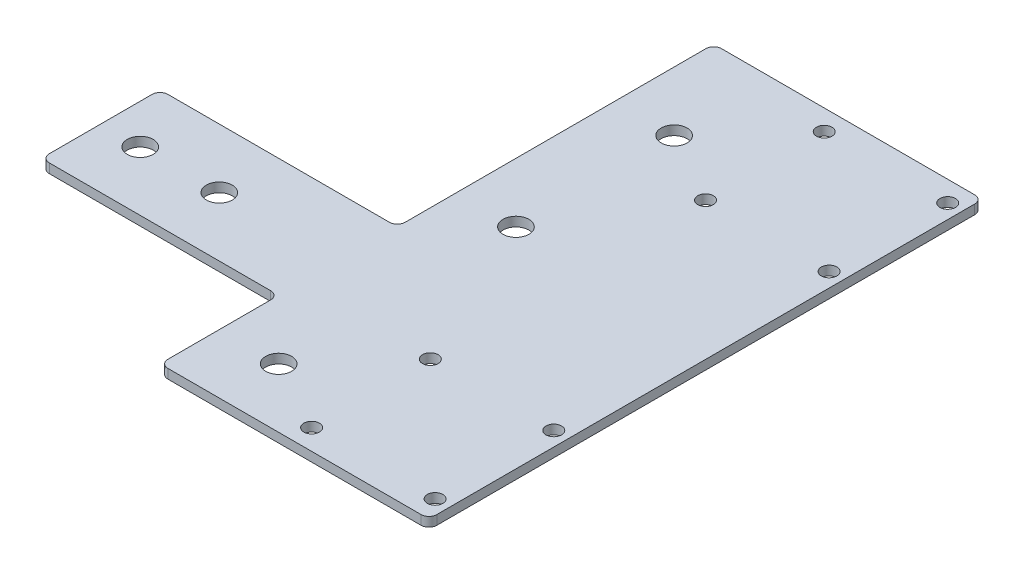
ISO-10303-21;
HEADER;
FILE_DESCRIPTION(('STEP AP214'),'2;1');
FILE_NAME('part.step','',(''),(''),'','','');
FILE_SCHEMA(('AUTOMOTIVE_DESIGN { 1 0 10303 214 1 1 1 1 }'));
ENDSEC;
DATA;
#1=APPLICATION_CONTEXT('core data for automotive mechanical design processes');
#2=APPLICATION_PROTOCOL_DEFINITION('international standard','automotive_design',2000,#1);
#3=PRODUCT_CONTEXT('',#1,'mechanical');
#4=PRODUCT('Part','Part','',(#3));
#5=PRODUCT_RELATED_PRODUCT_CATEGORY('part','',(#4));
#6=PRODUCT_DEFINITION_FORMATION('','',#4);
#7=PRODUCT_DEFINITION_CONTEXT('part definition',#1,'design');
#8=PRODUCT_DEFINITION('design','',#6,#7);
#9=PRODUCT_DEFINITION_SHAPE('','',#8);
#10=(LENGTH_UNIT() NAMED_UNIT(*) SI_UNIT(.MILLI.,.METRE.));
#11=(NAMED_UNIT(*) PLANE_ANGLE_UNIT() SI_UNIT($,.RADIAN.));
#12=(NAMED_UNIT(*) SI_UNIT($,.STERADIAN.) SOLID_ANGLE_UNIT());
#13=UNCERTAINTY_MEASURE_WITH_UNIT(LENGTH_MEASURE(1.E-05),#10,'distance_accuracy_value','');
#14=(GEOMETRIC_REPRESENTATION_CONTEXT(3) GLOBAL_UNCERTAINTY_ASSIGNED_CONTEXT((#13)) GLOBAL_UNIT_ASSIGNED_CONTEXT((#10,
#11,#12)) REPRESENTATION_CONTEXT('',''));
#15=CARTESIAN_POINT('',(0.,0.,0.));
#16=DIRECTION('',(0.,0.,1.));
#17=DIRECTION('',(1.,0.,0.));
#18=AXIS2_PLACEMENT_3D('',#15,#16,#17);
#19=CARTESIAN_POINT('',(-182.2975,3.,15.4226086956522));
#20=DIRECTION('',(0.,1.,0.));
#21=DIRECTION('',(0.,0.,1.));
#22=AXIS2_PLACEMENT_3D('',#19,#20,#21);
#23=PLANE('',#22);
#24=CARTESIAN_POINT('',(-172.1375,3.,31.9326086956522));
#25=DIRECTION('',(0.,1.,0.));
#26=DIRECTION('',(0.,0.,1.));
#27=AXIS2_PLACEMENT_3D('',#24,#25,#26);
#28=CIRCLE('',#27,4.1656);
#29=CARTESIAN_POINT('',(-172.1375,3.,36.0982086956522));
#30=VERTEX_POINT('',#29);
#31=EDGE_CURVE('E378',#30,#30,#28,.T.);
#32=ORIENTED_EDGE('',*,*,#31,.F.);
#33=EDGE_LOOP('',(#32));
#34=FACE_BOUND('',#33,.T.);
#35=CARTESIAN_POINT('',(-66.5475,3.,82.4826086956521));
#36=DIRECTION('',(0.,1.,0.));
#37=DIRECTION('',(0.,0.,-1.));
#38=AXIS2_PLACEMENT_3D('',#35,#36,#37);
#39=CIRCLE('',#38,2.5);
#40=CARTESIAN_POINT('',(-66.5475,3.,79.9826086956521));
#41=VERTEX_POINT('',#40);
#42=EDGE_CURVE('E390',#41,#41,#39,.T.);
#43=ORIENTED_EDGE('',*,*,#42,.F.);
#44=EDGE_LOOP('',(#43));
#45=FACE_BOUND('',#44,.T.);
#46=CARTESIAN_POINT('',(-66.5475,3.,44.3826086956522));
#47=DIRECTION('',(0.,1.,0.));
#48=DIRECTION('',(0.,0.,-1.));
#49=AXIS2_PLACEMENT_3D('',#46,#47,#48);
#50=CIRCLE('',#49,2.5);
#51=CARTESIAN_POINT('',(-66.5475,3.,41.8826086956522));
#52=VERTEX_POINT('',#51);
#53=EDGE_CURVE('E402',#52,#52,#50,.T.);
#54=ORIENTED_EDGE('',*,*,#53,.F.);
#55=EDGE_LOOP('',(#54));
#56=FACE_BOUND('',#55,.T.);
#57=CARTESIAN_POINT('',(-89.5875000000003,3.,-6.16739130434783));
#58=DIRECTION('',(0.,1.,0.));
#59=DIRECTION('',(0.,0.,1.));
#60=AXIS2_PLACEMENT_3D('',#57,#58,#59);
#61=CIRCLE('',#60,4.1656);
#62=CARTESIAN_POINT('',(-89.5875000000003,3.,-2.00179130434783));
#63=VERTEX_POINT('',#62);
#64=EDGE_CURVE('E414',#63,#63,#61,.T.);
#65=ORIENTED_EDGE('',*,*,#64,.F.);
#66=EDGE_LOOP('',(#65));
#67=FACE_BOUND('',#66,.T.);
#68=CARTESIAN_POINT('',(-66.5475,3.,-44.0173913043478));
#69=DIRECTION('',(0.,1.,0.));
#70=DIRECTION('',(0.,0.,1.));
#71=AXIS2_PLACEMENT_3D('',#68,#69,#70);
#72=CIRCLE('',#71,2.5);
#73=CARTESIAN_POINT('',(-66.5475,3.,-41.5173913043478));
#74=VERTEX_POINT('',#73);
#75=EDGE_CURVE('E426',#74,#74,#72,.T.);
#76=ORIENTED_EDGE('',*,*,#75,.F.);
#77=EDGE_LOOP('',(#76));
#78=FACE_BOUND('',#77,.T.);
#79=CARTESIAN_POINT('',(-66.5475,3.,-82.1173913043478));
#80=DIRECTION('',(0.,1.,0.));
#81=DIRECTION('',(0.,0.,1.));
#82=AXIS2_PLACEMENT_3D('',#79,#80,#81);
#83=CIRCLE('',#82,2.5);
#84=CARTESIAN_POINT('',(-66.5475,3.,-79.6173913043478));
#85=VERTEX_POINT('',#84);
#86=EDGE_CURVE('E438',#85,#85,#83,.T.);
#87=ORIENTED_EDGE('',*,*,#86,.F.);
#88=EDGE_LOOP('',(#87));
#89=FACE_BOUND('',#88,.T.);
#90=CARTESIAN_POINT('',(-182.2975,3.,15.4226086956522));
#91=DIRECTION('',(0.,1.,0.));
#92=DIRECTION('',(0.,0.,1.));
#93=AXIS2_PLACEMENT_3D('',#90,#91,#92);
#94=CIRCLE('',#93,2.53999999999998);
#95=CARTESIAN_POINT('',(-182.2975,3.,12.8826086956522));
#96=VERTEX_POINT('',#95);
#97=CARTESIAN_POINT('',(-184.8375,3.,15.4226086956522));
#98=VERTEX_POINT('',#97);
#99=EDGE_CURVE('E208',#96,#98,#94,.T.);
#100=ORIENTED_EDGE('',*,*,#99,.T.);
#101=DIRECTION('',(0.,0.,1.));
#102=VECTOR('',#101,1.);
#103=CARTESIAN_POINT('',(-184.8375,3.,48.4426086956522));
#104=LINE('',#103,#102);
#105=CARTESIAN_POINT('',(-184.8375,3.,48.4426086956522));
#106=VERTEX_POINT('',#105);
#107=EDGE_CURVE('E116',#98,#106,#104,.T.);
#108=ORIENTED_EDGE('',*,*,#107,.T.);
#109=CARTESIAN_POINT('',(-182.2975,3.,48.4426086956522));
#110=DIRECTION('',(0.,1.,0.));
#111=DIRECTION('',(0.,0.,-1.));
#112=AXIS2_PLACEMENT_3D('',#109,#110,#111);
#113=CIRCLE('',#112,2.54000000000001);
#114=CARTESIAN_POINT('',(-182.2975,3.,50.9826086956522));
#115=VERTEX_POINT('',#114);
#116=EDGE_CURVE('E247',#106,#115,#113,.T.);
#117=ORIENTED_EDGE('',*,*,#116,.T.);
#118=DIRECTION('',(1.,0.,0.));
#119=VECTOR('',#118,1.);
#120=CARTESIAN_POINT('',(-111.1775,3.,50.9826086956522));
#121=LINE('',#120,#119);
#122=CARTESIAN_POINT('',(-111.1775,3.,50.9826086956522));
#123=VERTEX_POINT('',#122);
#124=EDGE_CURVE('E266',#115,#123,#121,.T.);
#125=ORIENTED_EDGE('',*,*,#124,.T.);
#126=CARTESIAN_POINT('',(-111.1775,3.,53.5226086956522));
#127=DIRECTION('',(0.,-1.,0.));
#128=DIRECTION('',(0.,0.,1.));
#129=AXIS2_PLACEMENT_3D('',#126,#127,#128);
#130=CIRCLE('',#129,2.54);
#131=CARTESIAN_POINT('',(-108.6375,3.,53.5226086956522));
#132=VERTEX_POINT('',#131);
#133=EDGE_CURVE('E263',#123,#132,#130,.T.);
#134=ORIENTED_EDGE('',*,*,#133,.T.);
#135=DIRECTION('',(0.,0.,1.));
#136=VECTOR('',#135,1.);
#137=CARTESIAN_POINT('',(-108.6375,3.,53.5226086956522));
#138=LINE('',#137,#136);
#139=CARTESIAN_POINT('',(-108.6375,3.,86.5426086956522));
#140=VERTEX_POINT('',#139);
#141=EDGE_CURVE('E265',#132,#140,#138,.T.);
#142=ORIENTED_EDGE('',*,*,#141,.T.);
#143=CARTESIAN_POINT('',(-106.0975,3.,86.5426086956522));
#144=DIRECTION('',(0.,1.,0.));
#145=DIRECTION('',(0.,0.,-1.));
#146=AXIS2_PLACEMENT_3D('',#143,#144,#145);
#147=CIRCLE('',#146,2.54);
#148=CARTESIAN_POINT('',(-106.0975,3.,89.0826086956522));
#149=VERTEX_POINT('',#148);
#150=EDGE_CURVE('E268',#140,#149,#147,.T.);
#151=ORIENTED_EDGE('',*,*,#150,.T.);
#152=DIRECTION('',(1.,0.,0.));
#153=VECTOR('',#152,1.);
#154=CARTESIAN_POINT('',(-106.0975,3.,89.0826086956522));
#155=LINE('',#154,#153);
#156=CARTESIAN_POINT('',(-24.8175,3.,89.0826086956522));
#157=VERTEX_POINT('',#156);
#158=EDGE_CURVE('E274',#149,#157,#155,.T.);
#159=ORIENTED_EDGE('',*,*,#158,.T.);
#160=CARTESIAN_POINT('',(-24.8175,3.,86.5426086956522));
#161=DIRECTION('',(0.,1.,0.));
#162=DIRECTION('',(0.,0.,-1.));
#163=AXIS2_PLACEMENT_3D('',#160,#161,#162);
#164=CIRCLE('',#163,2.53999999999999);
#165=CARTESIAN_POINT('',(-22.2775,3.,86.5426086956522));
#166=VERTEX_POINT('',#165);
#167=EDGE_CURVE('E276',#157,#166,#164,.T.);
#168=ORIENTED_EDGE('',*,*,#167,.T.);
#169=DIRECTION('',(0.,0.,-1.));
#170=VECTOR('',#169,1.);
#171=CARTESIAN_POINT('',(-22.2775000000001,3.,-86.1773913043478));
#172=LINE('',#171,#170);
#173=CARTESIAN_POINT('',(-22.2775000000001,3.,-86.1773913043478));
#174=VERTEX_POINT('',#173);
#175=EDGE_CURVE('E278',#166,#174,#172,.T.);
#176=ORIENTED_EDGE('',*,*,#175,.T.);
#177=CARTESIAN_POINT('',(-24.8175000000001,3.,-86.1773913043478));
#178=DIRECTION('',(0.,1.,0.));
#179=DIRECTION('',(0.,0.,-1.));
#180=AXIS2_PLACEMENT_3D('',#177,#178,#179);
#181=CIRCLE('',#180,2.54000000000001);
#182=CARTESIAN_POINT('',(-24.8175000000001,3.,-88.7173913043478));
#183=VERTEX_POINT('',#182);
#184=EDGE_CURVE('E280',#174,#183,#181,.T.);
#185=ORIENTED_EDGE('',*,*,#184,.T.);
#186=DIRECTION('',(-1.,0.,0.));
#187=VECTOR('',#186,1.);
#188=CARTESIAN_POINT('',(-106.0975,3.,-88.7173913043478));
#189=LINE('',#188,#187);
#190=CARTESIAN_POINT('',(-106.0975,3.,-88.7173913043478));
#191=VERTEX_POINT('',#190);
#192=EDGE_CURVE('E282',#183,#191,#189,.T.);
#193=ORIENTED_EDGE('',*,*,#192,.T.);
#194=CARTESIAN_POINT('',(-106.0975,3.,-86.1773913043478));
#195=DIRECTION('',(0.,1.,0.));
#196=DIRECTION('',(0.,0.,1.));
#197=AXIS2_PLACEMENT_3D('',#194,#195,#196);
#198=CIRCLE('',#197,2.54000000000001);
#199=CARTESIAN_POINT('',(-108.6375,3.,-86.1773913043478));
#200=VERTEX_POINT('',#199);
#201=EDGE_CURVE('E159',#191,#200,#198,.T.);
#202=ORIENTED_EDGE('',*,*,#201,.T.);
#203=DIRECTION('',(0.,0.,1.));
#204=VECTOR('',#203,1.);
#205=CARTESIAN_POINT('',(-108.6375,3.,-86.1773913043478));
#206=LINE('',#205,#204);
#207=CARTESIAN_POINT('',(-108.6375,3.,10.3426086956522));
#208=VERTEX_POINT('',#207);
#209=EDGE_CURVE('E153',#200,#208,#206,.T.);
#210=ORIENTED_EDGE('',*,*,#209,.T.);
#211=CARTESIAN_POINT('',(-111.1775,3.,10.3426086956522));
#212=DIRECTION('',(0.,-1.,0.));
#213=DIRECTION('',(0.,0.,-1.));
#214=AXIS2_PLACEMENT_3D('',#211,#212,#213);
#215=CIRCLE('',#214,2.54000000000001);
#216=CARTESIAN_POINT('',(-111.1775,3.,12.8826086956522));
#217=VERTEX_POINT('',#216);
#218=EDGE_CURVE('E157',#208,#217,#215,.T.);
#219=ORIENTED_EDGE('',*,*,#218,.T.);
#220=DIRECTION('',(-1.,0.,0.));
#221=VECTOR('',#220,1.);
#222=CARTESIAN_POINT('',(-111.1775,3.,12.8826086956522));
#223=LINE('',#222,#221);
#224=EDGE_CURVE('E49',#217,#96,#223,.T.);
#225=ORIENTED_EDGE('',*,*,#224,.T.);
#226=EDGE_LOOP('',(#100,#108,#117,#125,#134,#142,#151,#159,#168,#176,#185,#193,#202,#210,#219,#225));
#227=FACE_BOUND('',#226,.T.);
#228=CARTESIAN_POINT('',(-89.5875,3.,70.0326086956521));
#229=DIRECTION('',(0.,1.,0.));
#230=DIRECTION('',(0.,0.,1.));
#231=AXIS2_PLACEMENT_3D('',#228,#229,#230);
#232=CIRCLE('',#231,4.1656);
#233=CARTESIAN_POINT('',(-89.5875,3.,74.1982086956522));
#234=VERTEX_POINT('',#233);
#235=EDGE_CURVE('E181',#234,#234,#232,.T.);
#236=ORIENTED_EDGE('',*,*,#235,.F.);
#237=EDGE_LOOP('',(#236));
#238=FACE_BOUND('',#237,.T.);
#239=CARTESIAN_POINT('',(-26.8975,3.,-82.1173913043478));
#240=DIRECTION('',(0.,1.,0.));
#241=DIRECTION('',(0.,0.,1.));
#242=AXIS2_PLACEMENT_3D('',#239,#240,#241);
#243=CIRCLE('',#242,2.5);
#244=CARTESIAN_POINT('',(-26.8975,3.,-79.6173913043478));
#245=VERTEX_POINT('',#244);
#246=EDGE_CURVE('E432',#245,#245,#243,.T.);
#247=ORIENTED_EDGE('',*,*,#246,.F.);
#248=EDGE_LOOP('',(#247));
#249=FACE_BOUND('',#248,.T.);
#250=CARTESIAN_POINT('',(-26.8975,3.,-44.0173913043478));
#251=DIRECTION('',(0.,1.,0.));
#252=DIRECTION('',(0.,0.,1.));
#253=AXIS2_PLACEMENT_3D('',#250,#251,#252);
#254=CIRCLE('',#253,2.5);
#255=CARTESIAN_POINT('',(-26.8975,3.,-41.5173913043478));
#256=VERTEX_POINT('',#255);
#257=EDGE_CURVE('E420',#256,#256,#254,.T.);
#258=ORIENTED_EDGE('',*,*,#257,.F.);
#259=EDGE_LOOP('',(#258));
#260=FACE_BOUND('',#259,.T.);
#261=CARTESIAN_POINT('',(-26.8975,3.,44.3826086956521));
#262=DIRECTION('',(0.,1.,0.));
#263=DIRECTION('',(0.,0.,-1.));
#264=AXIS2_PLACEMENT_3D('',#261,#262,#263);
#265=CIRCLE('',#264,2.5);
#266=CARTESIAN_POINT('',(-26.8975,3.,41.8826086956521));
#267=VERTEX_POINT('',#266);
#268=EDGE_CURVE('E408',#267,#267,#265,.T.);
#269=ORIENTED_EDGE('',*,*,#268,.F.);
#270=EDGE_LOOP('',(#269));
#271=FACE_BOUND('',#270,.T.);
#272=CARTESIAN_POINT('',(-26.8975,3.,82.4826086956521));
#273=DIRECTION('',(0.,1.,0.));
#274=DIRECTION('',(0.,0.,-1.));
#275=AXIS2_PLACEMENT_3D('',#272,#273,#274);
#276=CIRCLE('',#275,2.5);
#277=CARTESIAN_POINT('',(-26.8975,3.,79.9826086956521));
#278=VERTEX_POINT('',#277);
#279=EDGE_CURVE('E396',#278,#278,#276,.T.);
#280=ORIENTED_EDGE('',*,*,#279,.F.);
#281=EDGE_LOOP('',(#280));
#282=FACE_BOUND('',#281,.T.);
#283=CARTESIAN_POINT('',(-89.5875000000005,3.,-56.9673913043478));
#284=DIRECTION('',(0.,1.,0.));
#285=DIRECTION('',(0.,0.,1.));
#286=AXIS2_PLACEMENT_3D('',#283,#284,#285);
#287=CIRCLE('',#286,4.1656);
#288=CARTESIAN_POINT('',(-89.5875000000005,3.,-52.8017913043478));
#289=VERTEX_POINT('',#288);
#290=EDGE_CURVE('E384',#289,#289,#287,.T.);
#291=ORIENTED_EDGE('',*,*,#290,.F.);
#292=EDGE_LOOP('',(#291));
#293=FACE_BOUND('',#292,.T.);
#294=CARTESIAN_POINT('',(-146.7375,3.,31.9326086956522));
#295=DIRECTION('',(0.,1.,0.));
#296=DIRECTION('',(0.,0.,1.));
#297=AXIS2_PLACEMENT_3D('',#294,#295,#296);
#298=CIRCLE('',#297,4.1656);
#299=CARTESIAN_POINT('',(-146.7375,3.,36.0982086956522));
#300=VERTEX_POINT('',#299);
#301=EDGE_CURVE('E369',#300,#300,#298,.T.);
#302=ORIENTED_EDGE('',*,*,#301,.F.);
#303=EDGE_LOOP('',(#302));
#304=FACE_BOUND('',#303,.T.);
#305=ADVANCED_FACE('F32',(#34,#45,#56,#67,#78,#89,#227,#238,#249,#260,#271,#282,#293,#304),#23,.T.);
#306=CARTESIAN_POINT('',(-182.2975,0.,15.4226086956522));
#307=DIRECTION('',(0.,1.,0.));
#308=DIRECTION('',(0.,0.,1.));
#309=AXIS2_PLACEMENT_3D('',#306,#307,#308);
#310=PLANE('',#309);
#311=CARTESIAN_POINT('',(-182.2975,0.,15.4226086956522));
#312=DIRECTION('',(0.,1.,0.));
#313=DIRECTION('',(0.,0.,1.));
#314=AXIS2_PLACEMENT_3D('',#311,#312,#313);
#315=CIRCLE('',#314,2.53999999999998);
#316=CARTESIAN_POINT('',(-182.2975,0.,12.8826086956522));
#317=VERTEX_POINT('',#316);
#318=CARTESIAN_POINT('',(-184.8375,0.,15.4226086956522));
#319=VERTEX_POINT('',#318);
#320=EDGE_CURVE('E177',#317,#319,#315,.T.);
#321=ORIENTED_EDGE('',*,*,#320,.F.);
#322=DIRECTION('',(-1.,0.,0.));
#323=VECTOR('',#322,1.);
#324=CARTESIAN_POINT('',(-111.1775,0.,12.8826086956522));
#325=LINE('',#324,#323);
#326=CARTESIAN_POINT('',(-111.1775,0.,12.8826086956522));
#327=VERTEX_POINT('',#326);
#328=EDGE_CURVE('E108',#327,#317,#325,.T.);
#329=ORIENTED_EDGE('',*,*,#328,.F.);
#330=CARTESIAN_POINT('',(-111.1775,0.,10.3426086956522));
#331=DIRECTION('',(0.,-1.,0.));
#332=DIRECTION('',(0.,0.,-1.));
#333=AXIS2_PLACEMENT_3D('',#330,#331,#332);
#334=CIRCLE('',#333,2.54000000000001);
#335=CARTESIAN_POINT('',(-108.6375,0.,10.3426086956522));
#336=VERTEX_POINT('',#335);
#337=EDGE_CURVE('E102',#336,#327,#334,.T.);
#338=ORIENTED_EDGE('',*,*,#337,.F.);
#339=DIRECTION('',(0.,0.,1.));
#340=VECTOR('',#339,1.);
#341=CARTESIAN_POINT('',(-108.6375,0.,-86.1773913043478));
#342=LINE('',#341,#340);
#343=CARTESIAN_POINT('',(-108.6375,0.,-86.1773913043478));
#344=VERTEX_POINT('',#343);
#345=EDGE_CURVE('E167',#344,#336,#342,.T.);
#346=ORIENTED_EDGE('',*,*,#345,.F.);
#347=CARTESIAN_POINT('',(-106.0975,0.,-86.1773913043478));
#348=DIRECTION('',(0.,1.,0.));
#349=DIRECTION('',(0.,0.,1.));
#350=AXIS2_PLACEMENT_3D('',#347,#348,#349);
#351=CIRCLE('',#350,2.54000000000001);
#352=CARTESIAN_POINT('',(-106.0975,0.,-88.7173913043478));
#353=VERTEX_POINT('',#352);
#354=EDGE_CURVE('E203',#353,#344,#351,.T.);
#355=ORIENTED_EDGE('',*,*,#354,.F.);
#356=DIRECTION('',(-1.,0.,0.));
#357=VECTOR('',#356,1.);
#358=CARTESIAN_POINT('',(-106.0975,0.,-88.7173913043478));
#359=LINE('',#358,#357);
#360=CARTESIAN_POINT('',(-24.8175000000001,0.,-88.7173913043478));
#361=VERTEX_POINT('',#360);
#362=EDGE_CURVE('E201',#361,#353,#359,.T.);
#363=ORIENTED_EDGE('',*,*,#362,.F.);
#364=CARTESIAN_POINT('',(-24.8175000000001,0.,-86.1773913043478));
#365=DIRECTION('',(0.,1.,0.));
#366=DIRECTION('',(0.,0.,-1.));
#367=AXIS2_PLACEMENT_3D('',#364,#365,#366);
#368=CIRCLE('',#367,2.54000000000001);
#369=CARTESIAN_POINT('',(-22.2775000000001,0.,-86.1773913043478));
#370=VERTEX_POINT('',#369);
#371=EDGE_CURVE('E199',#370,#361,#368,.T.);
#372=ORIENTED_EDGE('',*,*,#371,.F.);
#373=DIRECTION('',(0.,0.,-1.));
#374=VECTOR('',#373,1.);
#375=CARTESIAN_POINT('',(-22.2775000000001,0.,-86.1773913043478));
#376=LINE('',#375,#374);
#377=CARTESIAN_POINT('',(-22.2775,0.,86.5426086956522));
#378=VERTEX_POINT('',#377);
#379=EDGE_CURVE('E197',#378,#370,#376,.T.);
#380=ORIENTED_EDGE('',*,*,#379,.F.);
#381=CARTESIAN_POINT('',(-24.8175,0.,86.5426086956522));
#382=DIRECTION('',(0.,1.,0.));
#383=DIRECTION('',(0.,0.,-1.));
#384=AXIS2_PLACEMENT_3D('',#381,#382,#383);
#385=CIRCLE('',#384,2.53999999999999);
#386=CARTESIAN_POINT('',(-24.8175,0.,89.0826086956522));
#387=VERTEX_POINT('',#386);
#388=EDGE_CURVE('E195',#387,#378,#385,.T.);
#389=ORIENTED_EDGE('',*,*,#388,.F.);
#390=DIRECTION('',(1.,0.,0.));
#391=VECTOR('',#390,1.);
#392=CARTESIAN_POINT('',(-106.0975,0.,89.0826086956522));
#393=LINE('',#392,#391);
#394=CARTESIAN_POINT('',(-106.0975,0.,89.0826086956522));
#395=VERTEX_POINT('',#394);
#396=EDGE_CURVE('E193',#395,#387,#393,.T.);
#397=ORIENTED_EDGE('',*,*,#396,.F.);
#398=CARTESIAN_POINT('',(-106.0975,0.,86.5426086956522));
#399=DIRECTION('',(0.,1.,0.));
#400=DIRECTION('',(0.,0.,-1.));
#401=AXIS2_PLACEMENT_3D('',#398,#399,#400);
#402=CIRCLE('',#401,2.54);
#403=CARTESIAN_POINT('',(-108.6375,0.,86.5426086956522));
#404=VERTEX_POINT('',#403);
#405=EDGE_CURVE('E191',#404,#395,#402,.T.);
#406=ORIENTED_EDGE('',*,*,#405,.F.);
#407=DIRECTION('',(0.,0.,1.));
#408=VECTOR('',#407,1.);
#409=CARTESIAN_POINT('',(-108.6375,0.,53.5226086956522));
#410=LINE('',#409,#408);
#411=CARTESIAN_POINT('',(-108.6375,0.,53.5226086956522));
#412=VERTEX_POINT('',#411);
#413=EDGE_CURVE('E189',#412,#404,#410,.T.);
#414=ORIENTED_EDGE('',*,*,#413,.F.);
#415=CARTESIAN_POINT('',(-111.1775,0.,53.5226086956522));
#416=DIRECTION('',(0.,-1.,0.));
#417=DIRECTION('',(0.,0.,1.));
#418=AXIS2_PLACEMENT_3D('',#415,#416,#417);
#419=CIRCLE('',#418,2.54);
#420=CARTESIAN_POINT('',(-111.1775,0.,50.9826086956522));
#421=VERTEX_POINT('',#420);
#422=EDGE_CURVE('E187',#421,#412,#419,.T.);
#423=ORIENTED_EDGE('',*,*,#422,.F.);
#424=DIRECTION('',(1.,0.,0.));
#425=VECTOR('',#424,1.);
#426=CARTESIAN_POINT('',(-111.1775,0.,50.9826086956522));
#427=LINE('',#426,#425);
#428=CARTESIAN_POINT('',(-182.2975,0.,50.9826086956522));
#429=VERTEX_POINT('',#428);
#430=EDGE_CURVE('E185',#429,#421,#427,.T.);
#431=ORIENTED_EDGE('',*,*,#430,.F.);
#432=CARTESIAN_POINT('',(-182.2975,0.,48.4426086956522));
#433=DIRECTION('',(0.,1.,0.));
#434=DIRECTION('',(0.,0.,-1.));
#435=AXIS2_PLACEMENT_3D('',#432,#433,#434);
#436=CIRCLE('',#435,2.54000000000001);
#437=CARTESIAN_POINT('',(-184.8375,0.,48.4426086956522));
#438=VERTEX_POINT('',#437);
#439=EDGE_CURVE('E183',#438,#429,#436,.T.);
#440=ORIENTED_EDGE('',*,*,#439,.F.);
#441=DIRECTION('',(0.,0.,1.));
#442=VECTOR('',#441,1.);
#443=CARTESIAN_POINT('',(-184.8375,0.,48.4426086956522));
#444=LINE('',#443,#442);
#445=EDGE_CURVE('E180',#319,#438,#444,.T.);
#446=ORIENTED_EDGE('',*,*,#445,.F.);
#447=EDGE_LOOP('',(#321,#329,#338,#346,#355,#363,#372,#380,#389,#397,#406,#414,#423,#431,#440,#446));
#448=FACE_BOUND('',#447,.T.);
#449=CARTESIAN_POINT('',(-89.5875,0.,70.0326086956521));
#450=DIRECTION('',(0.,1.,0.));
#451=DIRECTION('',(0.,0.,1.));
#452=AXIS2_PLACEMENT_3D('',#449,#450,#451);
#453=CIRCLE('',#452,4.1656);
#454=CARTESIAN_POINT('',(-89.5875,0.,74.1982086956522));
#455=VERTEX_POINT('',#454);
#456=EDGE_CURVE('E441',#455,#455,#453,.T.);
#457=ORIENTED_EDGE('',*,*,#456,.T.);
#458=EDGE_LOOP('',(#457));
#459=FACE_BOUND('',#458,.T.);
#460=CARTESIAN_POINT('',(-66.5475,0.,-82.1173913043478));
#461=DIRECTION('',(0.,1.,0.));
#462=DIRECTION('',(0.,0.,1.));
#463=AXIS2_PLACEMENT_3D('',#460,#461,#462);
#464=CIRCLE('',#463,2.5);
#465=CARTESIAN_POINT('',(-66.5475,0.,-79.6173913043478));
#466=VERTEX_POINT('',#465);
#467=EDGE_CURVE('E435',#466,#466,#464,.T.);
#468=ORIENTED_EDGE('',*,*,#467,.T.);
#469=EDGE_LOOP('',(#468));
#470=FACE_BOUND('',#469,.T.);
#471=CARTESIAN_POINT('',(-26.8975,0.,-82.1173913043478));
#472=DIRECTION('',(0.,1.,0.));
#473=DIRECTION('',(0.,0.,1.));
#474=AXIS2_PLACEMENT_3D('',#471,#472,#473);
#475=CIRCLE('',#474,2.5);
#476=CARTESIAN_POINT('',(-26.8975,0.,-79.6173913043478));
#477=VERTEX_POINT('',#476);
#478=EDGE_CURVE('E429',#477,#477,#475,.T.);
#479=ORIENTED_EDGE('',*,*,#478,.T.);
#480=EDGE_LOOP('',(#479));
#481=FACE_BOUND('',#480,.T.);
#482=CARTESIAN_POINT('',(-66.5475,0.,-44.0173913043478));
#483=DIRECTION('',(0.,1.,0.));
#484=DIRECTION('',(0.,0.,1.));
#485=AXIS2_PLACEMENT_3D('',#482,#483,#484);
#486=CIRCLE('',#485,2.5);
#487=CARTESIAN_POINT('',(-66.5475,0.,-41.5173913043478));
#488=VERTEX_POINT('',#487);
#489=EDGE_CURVE('E423',#488,#488,#486,.T.);
#490=ORIENTED_EDGE('',*,*,#489,.T.);
#491=EDGE_LOOP('',(#490));
#492=FACE_BOUND('',#491,.T.);
#493=CARTESIAN_POINT('',(-26.8975,0.,-44.0173913043478));
#494=DIRECTION('',(0.,1.,0.));
#495=DIRECTION('',(0.,0.,1.));
#496=AXIS2_PLACEMENT_3D('',#493,#494,#495);
#497=CIRCLE('',#496,2.5);
#498=CARTESIAN_POINT('',(-26.8975,0.,-41.5173913043478));
#499=VERTEX_POINT('',#498);
#500=EDGE_CURVE('E417',#499,#499,#497,.T.);
#501=ORIENTED_EDGE('',*,*,#500,.T.);
#502=EDGE_LOOP('',(#501));
#503=FACE_BOUND('',#502,.T.);
#504=CARTESIAN_POINT('',(-89.5875000000003,0.,-6.16739130434783));
#505=DIRECTION('',(0.,1.,0.));
#506=DIRECTION('',(0.,0.,1.));
#507=AXIS2_PLACEMENT_3D('',#504,#505,#506);
#508=CIRCLE('',#507,4.1656);
#509=CARTESIAN_POINT('',(-89.5875000000003,0.,-2.00179130434783));
#510=VERTEX_POINT('',#509);
#511=EDGE_CURVE('E411',#510,#510,#508,.T.);
#512=ORIENTED_EDGE('',*,*,#511,.T.);
#513=EDGE_LOOP('',(#512));
#514=FACE_BOUND('',#513,.T.);
#515=CARTESIAN_POINT('',(-26.8975,0.,44.3826086956521));
#516=DIRECTION('',(0.,1.,0.));
#517=DIRECTION('',(0.,0.,-1.));
#518=AXIS2_PLACEMENT_3D('',#515,#516,#517);
#519=CIRCLE('',#518,2.5);
#520=CARTESIAN_POINT('',(-26.8975,0.,41.8826086956521));
#521=VERTEX_POINT('',#520);
#522=EDGE_CURVE('E405',#521,#521,#519,.T.);
#523=ORIENTED_EDGE('',*,*,#522,.T.);
#524=EDGE_LOOP('',(#523));
#525=FACE_BOUND('',#524,.T.);
#526=CARTESIAN_POINT('',(-66.5475,0.,44.3826086956522));
#527=DIRECTION('',(0.,1.,0.));
#528=DIRECTION('',(0.,0.,-1.));
#529=AXIS2_PLACEMENT_3D('',#526,#527,#528);
#530=CIRCLE('',#529,2.5);
#531=CARTESIAN_POINT('',(-66.5475,0.,41.8826086956522));
#532=VERTEX_POINT('',#531);
#533=EDGE_CURVE('E399',#532,#532,#530,.T.);
#534=ORIENTED_EDGE('',*,*,#533,.T.);
#535=EDGE_LOOP('',(#534));
#536=FACE_BOUND('',#535,.T.);
#537=CARTESIAN_POINT('',(-26.8975,0.,82.4826086956521));
#538=DIRECTION('',(0.,1.,0.));
#539=DIRECTION('',(0.,0.,-1.));
#540=AXIS2_PLACEMENT_3D('',#537,#538,#539);
#541=CIRCLE('',#540,2.5);
#542=CARTESIAN_POINT('',(-26.8975,0.,79.9826086956521));
#543=VERTEX_POINT('',#542);
#544=EDGE_CURVE('E393',#543,#543,#541,.T.);
#545=ORIENTED_EDGE('',*,*,#544,.T.);
#546=EDGE_LOOP('',(#545));
#547=FACE_BOUND('',#546,.T.);
#548=CARTESIAN_POINT('',(-66.5475,0.,82.4826086956521));
#549=DIRECTION('',(0.,1.,0.));
#550=DIRECTION('',(0.,0.,-1.));
#551=AXIS2_PLACEMENT_3D('',#548,#549,#550);
#552=CIRCLE('',#551,2.5);
#553=CARTESIAN_POINT('',(-66.5475,0.,79.9826086956521));
#554=VERTEX_POINT('',#553);
#555=EDGE_CURVE('E387',#554,#554,#552,.T.);
#556=ORIENTED_EDGE('',*,*,#555,.T.);
#557=EDGE_LOOP('',(#556));
#558=FACE_BOUND('',#557,.T.);
#559=CARTESIAN_POINT('',(-89.5875000000005,0.,-56.9673913043478));
#560=DIRECTION('',(0.,1.,0.));
#561=DIRECTION('',(0.,0.,1.));
#562=AXIS2_PLACEMENT_3D('',#559,#560,#561);
#563=CIRCLE('',#562,4.1656);
#564=CARTESIAN_POINT('',(-89.5875000000005,0.,-52.8017913043478));
#565=VERTEX_POINT('',#564);
#566=EDGE_CURVE('E381',#565,#565,#563,.T.);
#567=ORIENTED_EDGE('',*,*,#566,.T.);
#568=EDGE_LOOP('',(#567));
#569=FACE_BOUND('',#568,.T.);
#570=CARTESIAN_POINT('',(-172.1375,0.,31.9326086956522));
#571=DIRECTION('',(0.,1.,0.));
#572=DIRECTION('',(0.,0.,1.));
#573=AXIS2_PLACEMENT_3D('',#570,#571,#572);
#574=CIRCLE('',#573,4.1656);
#575=CARTESIAN_POINT('',(-172.1375,0.,36.0982086956522));
#576=VERTEX_POINT('',#575);
#577=EDGE_CURVE('E375',#576,#576,#574,.T.);
#578=ORIENTED_EDGE('',*,*,#577,.T.);
#579=EDGE_LOOP('',(#578));
#580=FACE_BOUND('',#579,.T.);
#581=CARTESIAN_POINT('',(-146.7375,0.,31.9326086956522));
#582=DIRECTION('',(0.,1.,0.));
#583=DIRECTION('',(0.,0.,1.));
#584=AXIS2_PLACEMENT_3D('',#581,#582,#583);
#585=CIRCLE('',#584,4.1656);
#586=CARTESIAN_POINT('',(-146.7375,0.,36.0982086956522));
#587=VERTEX_POINT('',#586);
#588=EDGE_CURVE('E372',#587,#587,#585,.T.);
#589=ORIENTED_EDGE('',*,*,#588,.T.);
#590=EDGE_LOOP('',(#589));
#591=FACE_BOUND('',#590,.T.);
#592=ADVANCED_FACE('F251',(#448,#459,#470,#481,#492,#503,#514,#525,#536,#547,#558,#569,#580,
#591),#310,.F.);
#593=CARTESIAN_POINT('',(-182.2975,3.,15.4226086956522));
#594=DIRECTION('',(0.,-1.,0.));
#595=DIRECTION('',(0.,0.,-1.));
#596=AXIS2_PLACEMENT_3D('',#593,#594,#595);
#597=CYLINDRICAL_SURFACE('',#596,2.53999999999998);
#598=ORIENTED_EDGE('',*,*,#320,.T.);
#599=DIRECTION('',(0.,-1.,0.));
#600=VECTOR('',#599,1.);
#601=CARTESIAN_POINT('',(-184.8375,3.,15.4226086956522));
#602=LINE('',#601,#600);
#603=EDGE_CURVE('E11',#98,#319,#602,.T.);
#604=ORIENTED_EDGE('',*,*,#603,.F.);
#605=ORIENTED_EDGE('',*,*,#99,.F.);
#606=DIRECTION('',(0.,-1.,0.));
#607=VECTOR('',#606,1.);
#608=CARTESIAN_POINT('',(-182.2975,3.,12.8826086956522));
#609=LINE('',#608,#607);
#610=EDGE_CURVE('E173',#96,#317,#609,.T.);
#611=ORIENTED_EDGE('',*,*,#610,.T.);
#612=EDGE_LOOP('',(#598,#604,#605,#611));
#613=FACE_BOUND('',#612,.T.);
#614=ADVANCED_FACE('F34',(#613),#597,.T.);
#615=CARTESIAN_POINT('',(-184.8375,3.,48.4426086956522));
#616=DIRECTION('',(1.,0.,0.));
#617=DIRECTION('',(0.,0.,-1.));
#618=AXIS2_PLACEMENT_3D('',#615,#616,#617);
#619=PLANE('',#618);
#620=ORIENTED_EDGE('',*,*,#445,.T.);
#621=DIRECTION('',(0.,-1.,0.));
#622=VECTOR('',#621,1.);
#623=CARTESIAN_POINT('',(-184.8375,3.,48.4426086956522));
#624=LINE('',#623,#622);
#625=EDGE_CURVE('E41',#106,#438,#624,.T.);
#626=ORIENTED_EDGE('',*,*,#625,.F.);
#627=ORIENTED_EDGE('',*,*,#107,.F.);
#628=ORIENTED_EDGE('',*,*,#603,.T.);
#629=EDGE_LOOP('',(#620,#626,#627,#628));
#630=FACE_BOUND('',#629,.T.);
#631=ADVANCED_FACE('F672',(#630),#619,.F.);
#632=CARTESIAN_POINT('',(-182.2975,3.,48.4426086956522));
#633=DIRECTION('',(0.,-1.,0.));
#634=DIRECTION('',(0.,0.,-1.));
#635=AXIS2_PLACEMENT_3D('',#632,#633,#634);
#636=CYLINDRICAL_SURFACE('',#635,2.54000000000001);
#637=ORIENTED_EDGE('',*,*,#439,.T.);
#638=DIRECTION('',(0.,-1.,0.));
#639=VECTOR('',#638,1.);
#640=CARTESIAN_POINT('',(-182.2975,3.,50.9826086956522));
#641=LINE('',#640,#639);
#642=EDGE_CURVE('E239',#115,#429,#641,.T.);
#643=ORIENTED_EDGE('',*,*,#642,.F.);
#644=ORIENTED_EDGE('',*,*,#116,.F.);
#645=ORIENTED_EDGE('',*,*,#625,.T.);
#646=EDGE_LOOP('',(#637,#643,#644,#645));
#647=FACE_BOUND('',#646,.T.);
#648=ADVANCED_FACE('F245',(#647),#636,.T.);
#649=CARTESIAN_POINT('',(-111.1775,3.,50.9826086956522));
#650=DIRECTION('',(0.,0.,-1.));
#651=DIRECTION('',(-1.,0.,0.));
#652=AXIS2_PLACEMENT_3D('',#649,#650,#651);
#653=PLANE('',#652);
#654=ORIENTED_EDGE('',*,*,#430,.T.);
#655=DIRECTION('',(0.,-1.,0.));
#656=VECTOR('',#655,1.);
#657=CARTESIAN_POINT('',(-111.1775,3.,50.9826086956522));
#658=LINE('',#657,#656);
#659=EDGE_CURVE('E236',#123,#421,#658,.T.);
#660=ORIENTED_EDGE('',*,*,#659,.F.);
#661=ORIENTED_EDGE('',*,*,#124,.F.);
#662=ORIENTED_EDGE('',*,*,#642,.T.);
#663=EDGE_LOOP('',(#654,#660,#661,#662));
#664=FACE_BOUND('',#663,.T.);
#665=ADVANCED_FACE('F257',(#664),#653,.F.);
#666=CARTESIAN_POINT('',(-111.1775,3.,53.5226086956522));
#667=DIRECTION('',(0.,-1.,0.));
#668=DIRECTION('',(0.,0.,-1.));
#669=AXIS2_PLACEMENT_3D('',#666,#667,#668);
#670=CYLINDRICAL_SURFACE('',#669,2.54);
#671=ORIENTED_EDGE('',*,*,#422,.T.);
#672=DIRECTION('',(0.,-1.,0.));
#673=VECTOR('',#672,1.);
#674=CARTESIAN_POINT('',(-108.6375,3.,53.5226086956522));
#675=LINE('',#674,#673);
#676=EDGE_CURVE('E233',#132,#412,#675,.T.);
#677=ORIENTED_EDGE('',*,*,#676,.F.);
#678=ORIENTED_EDGE('',*,*,#133,.F.);
#679=ORIENTED_EDGE('',*,*,#659,.T.);
#680=EDGE_LOOP('',(#671,#677,#678,#679));
#681=FACE_BOUND('',#680,.T.);
#682=ADVANCED_FACE('F261',(#681),#670,.F.);
#683=CARTESIAN_POINT('',(-108.6375,3.,53.5226086956522));
#684=DIRECTION('',(1.,0.,0.));
#685=DIRECTION('',(0.,0.,-1.));
#686=AXIS2_PLACEMENT_3D('',#683,#684,#685);
#687=PLANE('',#686);
#688=ORIENTED_EDGE('',*,*,#413,.T.);
#689=DIRECTION('',(0.,-1.,0.));
#690=VECTOR('',#689,1.);
#691=CARTESIAN_POINT('',(-108.6375,3.,86.5426086956522));
#692=LINE('',#691,#690);
#693=EDGE_CURVE('E230',#140,#404,#692,.T.);
#694=ORIENTED_EDGE('',*,*,#693,.F.);
#695=ORIENTED_EDGE('',*,*,#141,.F.);
#696=ORIENTED_EDGE('',*,*,#676,.T.);
#697=EDGE_LOOP('',(#688,#694,#695,#696));
#698=FACE_BOUND('',#697,.T.);
#699=ADVANCED_FACE('F637',(#698),#687,.F.);
#700=CARTESIAN_POINT('',(-106.0975,3.,86.5426086956522));
#701=DIRECTION('',(0.,-1.,0.));
#702=DIRECTION('',(0.,0.,-1.));
#703=AXIS2_PLACEMENT_3D('',#700,#701,#702);
#704=CYLINDRICAL_SURFACE('',#703,2.54);
#705=ORIENTED_EDGE('',*,*,#405,.T.);
#706=DIRECTION('',(0.,-1.,0.));
#707=VECTOR('',#706,1.);
#708=CARTESIAN_POINT('',(-106.0975,3.,89.0826086956522));
#709=LINE('',#708,#707);
#710=EDGE_CURVE('E227',#149,#395,#709,.T.);
#711=ORIENTED_EDGE('',*,*,#710,.F.);
#712=ORIENTED_EDGE('',*,*,#150,.F.);
#713=ORIENTED_EDGE('',*,*,#693,.T.);
#714=EDGE_LOOP('',(#705,#711,#712,#713));
#715=FACE_BOUND('',#714,.T.);
#716=ADVANCED_FACE('F627',(#715),#704,.T.);
#717=CARTESIAN_POINT('',(-106.0975,3.,89.0826086956522));
#718=DIRECTION('',(0.,0.,-1.));
#719=DIRECTION('',(-1.,0.,0.));
#720=AXIS2_PLACEMENT_3D('',#717,#718,#719);
#721=PLANE('',#720);
#722=ORIENTED_EDGE('',*,*,#396,.T.);
#723=DIRECTION('',(0.,-1.,0.));
#724=VECTOR('',#723,1.);
#725=CARTESIAN_POINT('',(-24.8175,3.,89.0826086956522));
#726=LINE('',#725,#724);
#727=EDGE_CURVE('E224',#157,#387,#726,.T.);
#728=ORIENTED_EDGE('',*,*,#727,.F.);
#729=ORIENTED_EDGE('',*,*,#158,.F.);
#730=ORIENTED_EDGE('',*,*,#710,.T.);
#731=EDGE_LOOP('',(#722,#728,#729,#730));
#732=FACE_BOUND('',#731,.T.);
#733=ADVANCED_FACE('F617',(#732),#721,.F.);
#734=CARTESIAN_POINT('',(-24.8175,3.,86.5426086956522));
#735=DIRECTION('',(0.,-1.,0.));
#736=DIRECTION('',(0.,0.,-1.));
#737=AXIS2_PLACEMENT_3D('',#734,#735,#736);
#738=CYLINDRICAL_SURFACE('',#737,2.53999999999999);
#739=ORIENTED_EDGE('',*,*,#388,.T.);
#740=DIRECTION('',(0.,-1.,0.));
#741=VECTOR('',#740,1.);
#742=CARTESIAN_POINT('',(-22.2775,3.,86.5426086956522));
#743=LINE('',#742,#741);
#744=EDGE_CURVE('E221',#166,#378,#743,.T.);
#745=ORIENTED_EDGE('',*,*,#744,.F.);
#746=ORIENTED_EDGE('',*,*,#167,.F.);
#747=ORIENTED_EDGE('',*,*,#727,.T.);
#748=EDGE_LOOP('',(#739,#745,#746,#747));
#749=FACE_BOUND('',#748,.T.);
#750=ADVANCED_FACE('F607',(#749),#738,.T.);
#751=CARTESIAN_POINT('',(-22.2775000000001,3.,-86.1773913043478));
#752=DIRECTION('',(-1.,0.,0.));
#753=DIRECTION('',(0.,0.,1.));
#754=AXIS2_PLACEMENT_3D('',#751,#752,#753);
#755=PLANE('',#754);
#756=ORIENTED_EDGE('',*,*,#379,.T.);
#757=DIRECTION('',(0.,-1.,0.));
#758=VECTOR('',#757,1.);
#759=CARTESIAN_POINT('',(-22.2775000000001,3.,-86.1773913043478));
#760=LINE('',#759,#758);
#761=EDGE_CURVE('E218',#174,#370,#760,.T.);
#762=ORIENTED_EDGE('',*,*,#761,.F.);
#763=ORIENTED_EDGE('',*,*,#175,.F.);
#764=ORIENTED_EDGE('',*,*,#744,.T.);
#765=EDGE_LOOP('',(#756,#762,#763,#764));
#766=FACE_BOUND('',#765,.T.);
#767=ADVANCED_FACE('F597',(#766),#755,.F.);
#768=CARTESIAN_POINT('',(-24.8175000000001,3.,-86.1773913043478));
#769=DIRECTION('',(0.,-1.,0.));
#770=DIRECTION('',(0.,0.,-1.));
#771=AXIS2_PLACEMENT_3D('',#768,#769,#770);
#772=CYLINDRICAL_SURFACE('',#771,2.54000000000001);
#773=ORIENTED_EDGE('',*,*,#371,.T.);
#774=DIRECTION('',(0.,-1.,0.));
#775=VECTOR('',#774,1.);
#776=CARTESIAN_POINT('',(-24.8175000000001,3.,-88.7173913043478));
#777=LINE('',#776,#775);
#778=EDGE_CURVE('E215',#183,#361,#777,.T.);
#779=ORIENTED_EDGE('',*,*,#778,.F.);
#780=ORIENTED_EDGE('',*,*,#184,.F.);
#781=ORIENTED_EDGE('',*,*,#761,.T.);
#782=EDGE_LOOP('',(#773,#779,#780,#781));
#783=FACE_BOUND('',#782,.T.);
#784=ADVANCED_FACE('F588',(#783),#772,.T.);
#785=CARTESIAN_POINT('',(-106.0975,3.,-88.7173913043478));
#786=DIRECTION('',(0.,0.,1.));
#787=DIRECTION('',(1.,0.,0.));
#788=AXIS2_PLACEMENT_3D('',#785,#786,#787);
#789=PLANE('',#788);
#790=ORIENTED_EDGE('',*,*,#362,.T.);
#791=DIRECTION('',(0.,-1.,0.));
#792=VECTOR('',#791,1.);
#793=CARTESIAN_POINT('',(-106.0975,3.,-88.7173913043478));
#794=LINE('',#793,#792);
#795=EDGE_CURVE('E212',#191,#353,#794,.T.);
#796=ORIENTED_EDGE('',*,*,#795,.F.);
#797=ORIENTED_EDGE('',*,*,#192,.F.);
#798=ORIENTED_EDGE('',*,*,#778,.T.);
#799=EDGE_LOOP('',(#790,#796,#797,#798));
#800=FACE_BOUND('',#799,.T.);
#801=ADVANCED_FACE('F288',(#800),#789,.F.);
#802=CARTESIAN_POINT('',(-106.0975,3.,-86.1773913043478));
#803=DIRECTION('',(0.,-1.,0.));
#804=DIRECTION('',(0.,0.,-1.));
#805=AXIS2_PLACEMENT_3D('',#802,#803,#804);
#806=CYLINDRICAL_SURFACE('',#805,2.54000000000001);
#807=ORIENTED_EDGE('',*,*,#354,.T.);
#808=DIRECTION('',(0.,-1.,0.));
#809=VECTOR('',#808,1.);
#810=CARTESIAN_POINT('',(-108.6375,3.,-86.1773913043478));
#811=LINE('',#810,#809);
#812=EDGE_CURVE('E168',#200,#344,#811,.T.);
#813=ORIENTED_EDGE('',*,*,#812,.F.);
#814=ORIENTED_EDGE('',*,*,#201,.F.);
#815=ORIENTED_EDGE('',*,*,#795,.T.);
#816=EDGE_LOOP('',(#807,#813,#814,#815));
#817=FACE_BOUND('',#816,.T.);
#818=ADVANCED_FACE('F292',(#817),#806,.T.);
#819=CARTESIAN_POINT('',(-108.6375,3.,-86.1773913043478));
#820=DIRECTION('',(1.,0.,0.));
#821=DIRECTION('',(0.,0.,-1.));
#822=AXIS2_PLACEMENT_3D('',#819,#820,#821);
#823=PLANE('',#822);
#824=ORIENTED_EDGE('',*,*,#345,.T.);
#825=DIRECTION('',(0.,-1.,0.));
#826=VECTOR('',#825,1.);
#827=CARTESIAN_POINT('',(-108.6375,3.,10.3426086956522));
#828=LINE('',#827,#826);
#829=EDGE_CURVE('E164',#208,#336,#828,.T.);
#830=ORIENTED_EDGE('',*,*,#829,.F.);
#831=ORIENTED_EDGE('',*,*,#209,.F.);
#832=ORIENTED_EDGE('',*,*,#812,.T.);
#833=EDGE_LOOP('',(#824,#830,#831,#832));
#834=FACE_BOUND('',#833,.T.);
#835=ADVANCED_FACE('F165',(#834),#823,.F.);
#836=CARTESIAN_POINT('',(-111.1775,3.,10.3426086956522));
#837=DIRECTION('',(0.,-1.,0.));
#838=DIRECTION('',(0.,0.,-1.));
#839=AXIS2_PLACEMENT_3D('',#836,#837,#838);
#840=CYLINDRICAL_SURFACE('',#839,2.54000000000001);
#841=ORIENTED_EDGE('',*,*,#337,.T.);
#842=DIRECTION('',(0.,-1.,0.));
#843=VECTOR('',#842,1.);
#844=CARTESIAN_POINT('',(-111.1775,3.,12.8826086956522));
#845=LINE('',#844,#843);
#846=EDGE_CURVE('E169',#217,#327,#845,.T.);
#847=ORIENTED_EDGE('',*,*,#846,.F.);
#848=ORIENTED_EDGE('',*,*,#218,.F.);
#849=ORIENTED_EDGE('',*,*,#829,.T.);
#850=EDGE_LOOP('',(#841,#847,#848,#849));
#851=FACE_BOUND('',#850,.T.);
#852=ADVANCED_FACE('F171',(#851),#840,.F.);
#853=CARTESIAN_POINT('',(-111.1775,3.,12.8826086956522));
#854=DIRECTION('',(0.,0.,1.));
#855=DIRECTION('',(1.,0.,0.));
#856=AXIS2_PLACEMENT_3D('',#853,#854,#855);
#857=PLANE('',#856);
#858=ORIENTED_EDGE('',*,*,#328,.T.);
#859=ORIENTED_EDGE('',*,*,#610,.F.);
#860=ORIENTED_EDGE('',*,*,#224,.F.);
#861=ORIENTED_EDGE('',*,*,#846,.T.);
#862=EDGE_LOOP('',(#858,#859,#860,#861));
#863=FACE_BOUND('',#862,.T.);
#864=ADVANCED_FACE('F296',(#863),#857,.F.);
#865=CARTESIAN_POINT('',(-89.5875,3.,70.0326086956521));
#866=DIRECTION('',(0.,-1.,0.));
#867=DIRECTION('',(0.,0.,-1.));
#868=AXIS2_PLACEMENT_3D('',#865,#866,#867);
#869=CYLINDRICAL_SURFACE('',#868,4.1656);
#870=ORIENTED_EDGE('',*,*,#235,.T.);
#871=EDGE_LOOP('',(#870));
#872=FACE_BOUND('',#871,.T.);
#873=ORIENTED_EDGE('',*,*,#456,.F.);
#874=EDGE_LOOP('',(#873));
#875=FACE_BOUND('',#874,.T.);
#876=ADVANCED_FACE('F298',(#872,#875),#869,.F.);
#877=CARTESIAN_POINT('',(-66.5475,3.,-82.1173913043478));
#878=DIRECTION('',(0.,-1.,0.));
#879=DIRECTION('',(0.,0.,-1.));
#880=AXIS2_PLACEMENT_3D('',#877,#878,#879);
#881=CYLINDRICAL_SURFACE('',#880,2.5);
#882=ORIENTED_EDGE('',*,*,#86,.T.);
#883=EDGE_LOOP('',(#882));
#884=FACE_BOUND('',#883,.T.);
#885=ORIENTED_EDGE('',*,*,#467,.F.);
#886=EDGE_LOOP('',(#885));
#887=FACE_BOUND('',#886,.T.);
#888=ADVANCED_FACE('F304',(#884,#887),#881,.F.);
#889=CARTESIAN_POINT('',(-26.8975,3.,-82.1173913043478));
#890=DIRECTION('',(0.,-1.,0.));
#891=DIRECTION('',(0.,0.,-1.));
#892=AXIS2_PLACEMENT_3D('',#889,#890,#891);
#893=CYLINDRICAL_SURFACE('',#892,2.5);
#894=ORIENTED_EDGE('',*,*,#246,.T.);
#895=EDGE_LOOP('',(#894));
#896=FACE_BOUND('',#895,.T.);
#897=ORIENTED_EDGE('',*,*,#478,.F.);
#898=EDGE_LOOP('',(#897));
#899=FACE_BOUND('',#898,.T.);
#900=ADVANCED_FACE('F320',(#896,#899),#893,.F.);
#901=CARTESIAN_POINT('',(-66.5475,3.,-44.0173913043478));
#902=DIRECTION('',(0.,-1.,0.));
#903=DIRECTION('',(0.,0.,-1.));
#904=AXIS2_PLACEMENT_3D('',#901,#902,#903);
#905=CYLINDRICAL_SURFACE('',#904,2.5);
#906=ORIENTED_EDGE('',*,*,#75,.T.);
#907=EDGE_LOOP('',(#906));
#908=FACE_BOUND('',#907,.T.);
#909=ORIENTED_EDGE('',*,*,#489,.F.);
#910=EDGE_LOOP('',(#909));
#911=FACE_BOUND('',#910,.T.);
#912=ADVANCED_FACE('F324',(#908,#911),#905,.F.);
#913=CARTESIAN_POINT('',(-26.8975,3.,-44.0173913043478));
#914=DIRECTION('',(0.,-1.,0.));
#915=DIRECTION('',(0.,0.,-1.));
#916=AXIS2_PLACEMENT_3D('',#913,#914,#915);
#917=CYLINDRICAL_SURFACE('',#916,2.5);
#918=ORIENTED_EDGE('',*,*,#257,.T.);
#919=EDGE_LOOP('',(#918));
#920=FACE_BOUND('',#919,.T.);
#921=ORIENTED_EDGE('',*,*,#500,.F.);
#922=EDGE_LOOP('',(#921));
#923=FACE_BOUND('',#922,.T.);
#924=ADVANCED_FACE('F328',(#920,#923),#917,.F.);
#925=CARTESIAN_POINT('',(-89.5875000000003,3.,-6.16739130434783));
#926=DIRECTION('',(0.,-1.,0.));
#927=DIRECTION('',(0.,0.,-1.));
#928=AXIS2_PLACEMENT_3D('',#925,#926,#927);
#929=CYLINDRICAL_SURFACE('',#928,4.1656);
#930=ORIENTED_EDGE('',*,*,#64,.T.);
#931=EDGE_LOOP('',(#930));
#932=FACE_BOUND('',#931,.T.);
#933=ORIENTED_EDGE('',*,*,#511,.F.);
#934=EDGE_LOOP('',(#933));
#935=FACE_BOUND('',#934,.T.);
#936=ADVANCED_FACE('F332',(#932,#935),#929,.F.);
#937=CARTESIAN_POINT('',(-26.8975,3.,44.3826086956521));
#938=DIRECTION('',(0.,-1.,0.));
#939=DIRECTION('',(0.,0.,-1.));
#940=AXIS2_PLACEMENT_3D('',#937,#938,#939);
#941=CYLINDRICAL_SURFACE('',#940,2.5);
#942=ORIENTED_EDGE('',*,*,#268,.T.);
#943=EDGE_LOOP('',(#942));
#944=FACE_BOUND('',#943,.T.);
#945=ORIENTED_EDGE('',*,*,#522,.F.);
#946=EDGE_LOOP('',(#945));
#947=FACE_BOUND('',#946,.T.);
#948=ADVANCED_FACE('F336',(#944,#947),#941,.F.);
#949=CARTESIAN_POINT('',(-66.5475,3.,44.3826086956522));
#950=DIRECTION('',(0.,-1.,0.));
#951=DIRECTION('',(0.,0.,-1.));
#952=AXIS2_PLACEMENT_3D('',#949,#950,#951);
#953=CYLINDRICAL_SURFACE('',#952,2.5);
#954=ORIENTED_EDGE('',*,*,#53,.T.);
#955=EDGE_LOOP('',(#954));
#956=FACE_BOUND('',#955,.T.);
#957=ORIENTED_EDGE('',*,*,#533,.F.);
#958=EDGE_LOOP('',(#957));
#959=FACE_BOUND('',#958,.T.);
#960=ADVANCED_FACE('F340',(#956,#959),#953,.F.);
#961=CARTESIAN_POINT('',(-26.8975,3.,82.4826086956521));
#962=DIRECTION('',(0.,-1.,0.));
#963=DIRECTION('',(0.,0.,-1.));
#964=AXIS2_PLACEMENT_3D('',#961,#962,#963);
#965=CYLINDRICAL_SURFACE('',#964,2.5);
#966=ORIENTED_EDGE('',*,*,#279,.T.);
#967=EDGE_LOOP('',(#966));
#968=FACE_BOUND('',#967,.T.);
#969=ORIENTED_EDGE('',*,*,#544,.F.);
#970=EDGE_LOOP('',(#969));
#971=FACE_BOUND('',#970,.T.);
#972=ADVANCED_FACE('F344',(#968,#971),#965,.F.);
#973=CARTESIAN_POINT('',(-66.5475,3.,82.4826086956521));
#974=DIRECTION('',(0.,-1.,0.));
#975=DIRECTION('',(0.,0.,-1.));
#976=AXIS2_PLACEMENT_3D('',#973,#974,#975);
#977=CYLINDRICAL_SURFACE('',#976,2.5);
#978=ORIENTED_EDGE('',*,*,#42,.T.);
#979=EDGE_LOOP('',(#978));
#980=FACE_BOUND('',#979,.T.);
#981=ORIENTED_EDGE('',*,*,#555,.F.);
#982=EDGE_LOOP('',(#981));
#983=FACE_BOUND('',#982,.T.);
#984=ADVANCED_FACE('F348',(#980,#983),#977,.F.);
#985=CARTESIAN_POINT('',(-89.5875000000005,3.,-56.9673913043478));
#986=DIRECTION('',(0.,-1.,0.));
#987=DIRECTION('',(0.,0.,-1.));
#988=AXIS2_PLACEMENT_3D('',#985,#986,#987);
#989=CYLINDRICAL_SURFACE('',#988,4.1656);
#990=ORIENTED_EDGE('',*,*,#290,.T.);
#991=EDGE_LOOP('',(#990));
#992=FACE_BOUND('',#991,.T.);
#993=ORIENTED_EDGE('',*,*,#566,.F.);
#994=EDGE_LOOP('',(#993));
#995=FACE_BOUND('',#994,.T.);
#996=ADVANCED_FACE('F352',(#992,#995),#989,.F.);
#997=CARTESIAN_POINT('',(-172.1375,3.,31.9326086956522));
#998=DIRECTION('',(0.,-1.,0.));
#999=DIRECTION('',(0.,0.,-1.));
#1000=AXIS2_PLACEMENT_3D('',#997,#998,#999);
#1001=CYLINDRICAL_SURFACE('',#1000,4.1656);
#1002=ORIENTED_EDGE('',*,*,#31,.T.);
#1003=EDGE_LOOP('',(#1002));
#1004=FACE_BOUND('',#1003,.T.);
#1005=ORIENTED_EDGE('',*,*,#577,.F.);
#1006=EDGE_LOOP('',(#1005));
#1007=FACE_BOUND('',#1006,.T.);
#1008=ADVANCED_FACE('F356',(#1004,#1007),#1001,.F.);
#1009=CARTESIAN_POINT('',(-146.7375,3.,31.9326086956522));
#1010=DIRECTION('',(0.,-1.,0.));
#1011=DIRECTION('',(0.,0.,-1.));
#1012=AXIS2_PLACEMENT_3D('',#1009,#1010,#1011);
#1013=CYLINDRICAL_SURFACE('',#1012,4.1656);
#1014=ORIENTED_EDGE('',*,*,#301,.T.);
#1015=EDGE_LOOP('',(#1014));
#1016=FACE_BOUND('',#1015,.T.);
#1017=ORIENTED_EDGE('',*,*,#588,.F.);
#1018=EDGE_LOOP('',(#1017));
#1019=FACE_BOUND('',#1018,.T.);
#1020=ADVANCED_FACE('F360',(#1016,#1019),#1013,.F.);
#1021=CLOSED_SHELL('',(#305,#592,#614,#631,#648,#665,#682,#699,#716,#733,#750,#767,#784,#801,
#818,#835,#852,#864,#876,#888,#900,#912,#924,#936,#948,#960,#972,#984,#996,#1008,#1020));
#1022=MANIFOLD_SOLID_BREP('B2',#1021);
#1023=ADVANCED_BREP_SHAPE_REPRESENTATION('',(#18,#1022),#14);
#1024=SHAPE_DEFINITION_REPRESENTATION(#9,#1023);
ENDSEC;
END-ISO-10303-21;
